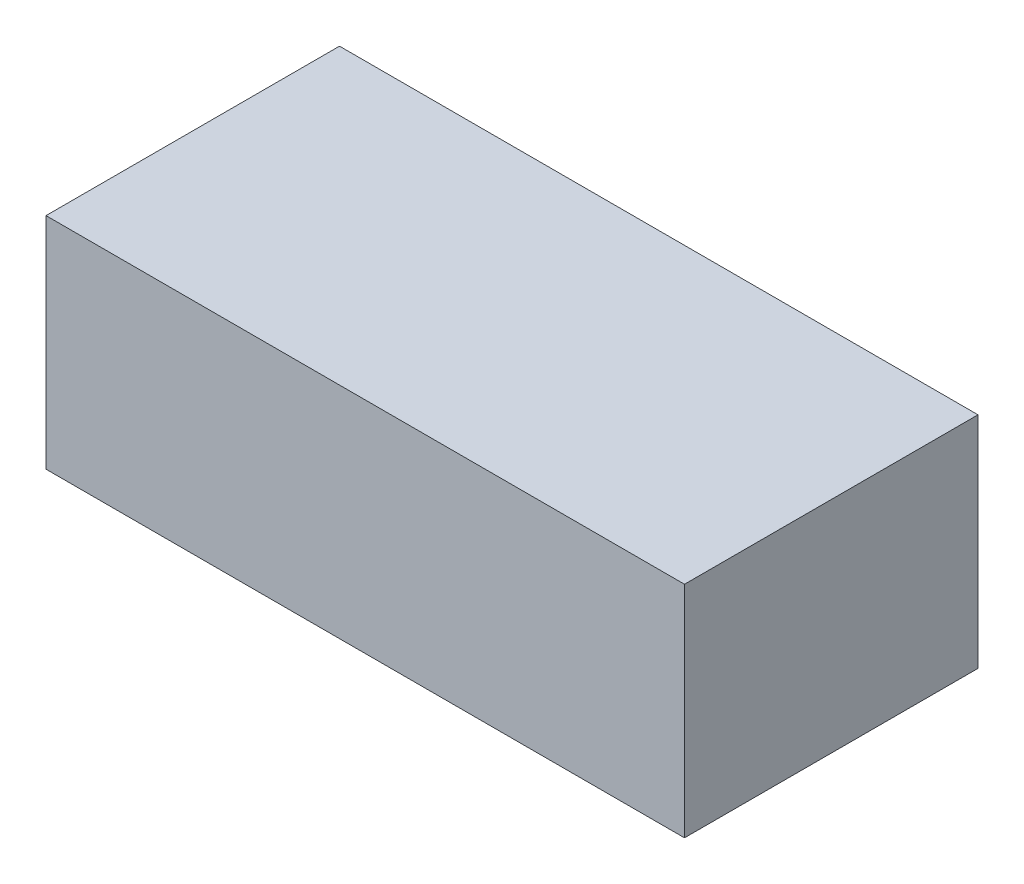
ISO-10303-21;
HEADER;
FILE_DESCRIPTION(('STEP AP214'),'2;1');
FILE_NAME('part.step','',(''),(''),'','','');
FILE_SCHEMA(('AUTOMOTIVE_DESIGN { 1 0 10303 214 1 1 1 1 }'));
ENDSEC;
DATA;
#1=APPLICATION_CONTEXT('core data for automotive mechanical design processes');
#2=APPLICATION_PROTOCOL_DEFINITION('international standard','automotive_design',2000,#1);
#3=PRODUCT_CONTEXT('',#1,'mechanical');
#4=PRODUCT('Part','Part','',(#3));
#5=PRODUCT_RELATED_PRODUCT_CATEGORY('part','',(#4));
#6=PRODUCT_DEFINITION_FORMATION('','',#4);
#7=PRODUCT_DEFINITION_CONTEXT('part definition',#1,'design');
#8=PRODUCT_DEFINITION('design','',#6,#7);
#9=PRODUCT_DEFINITION_SHAPE('','',#8);
#10=(LENGTH_UNIT() NAMED_UNIT(*) SI_UNIT(.MILLI.,.METRE.));
#11=(NAMED_UNIT(*) PLANE_ANGLE_UNIT() SI_UNIT($,.RADIAN.));
#12=(NAMED_UNIT(*) SI_UNIT($,.STERADIAN.) SOLID_ANGLE_UNIT());
#13=UNCERTAINTY_MEASURE_WITH_UNIT(LENGTH_MEASURE(1.E-05),#10,'distance_accuracy_value','');
#14=(GEOMETRIC_REPRESENTATION_CONTEXT(3) GLOBAL_UNCERTAINTY_ASSIGNED_CONTEXT((#13)) GLOBAL_UNIT_ASSIGNED_CONTEXT((#10,
#11,#12)) REPRESENTATION_CONTEXT('',''));
#15=CARTESIAN_POINT('',(0.,0.,0.));
#16=DIRECTION('',(0.,0.,1.));
#17=DIRECTION('',(1.,0.,0.));
#18=AXIS2_PLACEMENT_3D('',#15,#16,#17);
#19=CARTESIAN_POINT('',(0.,0.,0.));
#20=DIRECTION('',(0.,1.,0.));
#21=DIRECTION('',(0.,0.,1.));
#22=AXIS2_PLACEMENT_3D('',#19,#20,#21);
#23=PLANE('',#22);
#24=DIRECTION('',(0.,0.,-1.));
#25=VECTOR('',#24,1.);
#26=CARTESIAN_POINT('',(32.25,0.,-14.5));
#27=LINE('',#26,#25);
#28=CARTESIAN_POINT('',(32.25,0.,13.));
#29=VERTEX_POINT('',#28);
#30=CARTESIAN_POINT('',(32.25,0.,-13.));
#31=VERTEX_POINT('',#30);
#32=EDGE_CURVE('E354',#29,#31,#27,.T.);
#33=ORIENTED_EDGE('',*,*,#32,.T.);
#34=DIRECTION('',(0.707106781186543,0.,0.707106781186552));
#35=VECTOR('',#34,1.);
#36=CARTESIAN_POINT('',(22.6250000000002,0.,-22.6249999999999));
#37=LINE('',#36,#35);
#38=CARTESIAN_POINT('',(30.75,0.,-14.5));
#39=VERTEX_POINT('',#38);
#40=EDGE_CURVE('E11',#31,#39,#37,.F.);
#41=ORIENTED_EDGE('',*,*,#40,.T.);
#42=DIRECTION('',(-1.,0.,0.));
#43=VECTOR('',#42,1.);
#44=CARTESIAN_POINT('',(-32.25,0.,-14.5));
#45=LINE('',#44,#43);
#46=CARTESIAN_POINT('',(30.,0.,-14.5));
#47=VERTEX_POINT('',#46);
#48=EDGE_CURVE('E185',#39,#47,#45,.T.);
#49=ORIENTED_EDGE('',*,*,#48,.T.);
#50=DIRECTION('',(0.,0.,-1.));
#51=VECTOR('',#50,1.);
#52=CARTESIAN_POINT('',(30.,0.,-4.5));
#53=LINE('',#52,#51);
#54=CARTESIAN_POINT('',(30.,0.,-15.1));
#55=VERTEX_POINT('',#54);
#56=EDGE_CURVE('E169',#47,#55,#53,.T.);
#57=ORIENTED_EDGE('',*,*,#56,.T.);
#58=DIRECTION('',(-1.,0.,0.));
#59=VECTOR('',#58,1.);
#60=CARTESIAN_POINT('',(-32.85,0.,-15.1));
#61=LINE('',#60,#59);
#62=CARTESIAN_POINT('',(32.85,0.,-15.1));
#63=VERTEX_POINT('',#62);
#64=EDGE_CURVE('E184',#63,#55,#61,.T.);
#65=ORIENTED_EDGE('',*,*,#64,.F.);
#66=DIRECTION('',(0.,0.,-1.));
#67=VECTOR('',#66,1.);
#68=CARTESIAN_POINT('',(32.85,0.,-15.1));
#69=LINE('',#68,#67);
#70=CARTESIAN_POINT('',(32.85,0.,15.1));
#71=VERTEX_POINT('',#70);
#72=EDGE_CURVE('E202',#71,#63,#69,.T.);
#73=ORIENTED_EDGE('',*,*,#72,.F.);
#74=DIRECTION('',(1.,0.,0.));
#75=VECTOR('',#74,1.);
#76=CARTESIAN_POINT('',(-32.85,0.,15.1));
#77=LINE('',#76,#75);
#78=CARTESIAN_POINT('',(-32.85,0.,15.1));
#79=VERTEX_POINT('',#78);
#80=EDGE_CURVE('E372',#79,#71,#77,.T.);
#81=ORIENTED_EDGE('',*,*,#80,.F.);
#82=DIRECTION('',(0.,0.,1.));
#83=VECTOR('',#82,1.);
#84=CARTESIAN_POINT('',(-32.85,0.,-15.1));
#85=LINE('',#84,#83);
#86=CARTESIAN_POINT('',(-32.85,0.,-15.1));
#87=VERTEX_POINT('',#86);
#88=EDGE_CURVE('E369',#87,#79,#85,.T.);
#89=ORIENTED_EDGE('',*,*,#88,.F.);
#90=CARTESIAN_POINT('',(-30.,0.,-15.1));
#91=VERTEX_POINT('',#90);
#92=EDGE_CURVE('E196',#91,#87,#61,.T.);
#93=ORIENTED_EDGE('',*,*,#92,.F.);
#94=DIRECTION('',(0.,0.,-1.));
#95=VECTOR('',#94,1.);
#96=CARTESIAN_POINT('',(-30.,0.,-4.5));
#97=LINE('',#96,#95);
#98=CARTESIAN_POINT('',(-30.,0.,-14.5));
#99=VERTEX_POINT('',#98);
#100=EDGE_CURVE('E187',#99,#91,#97,.T.);
#101=ORIENTED_EDGE('',*,*,#100,.F.);
#102=CARTESIAN_POINT('',(-30.75,0.,-14.5));
#103=VERTEX_POINT('',#102);
#104=EDGE_CURVE('E348',#99,#103,#45,.T.);
#105=ORIENTED_EDGE('',*,*,#104,.T.);
#106=DIRECTION('',(0.707106781186543,0.,-0.707106781186552));
#107=VECTOR('',#106,1.);
#108=CARTESIAN_POINT('',(-22.6250000000002,0.,-22.6249999999999));
#109=LINE('',#108,#107);
#110=CARTESIAN_POINT('',(-32.25,0.,-13.));
#111=VERTEX_POINT('',#110);
#112=EDGE_CURVE('E49',#103,#111,#109,.F.);
#113=ORIENTED_EDGE('',*,*,#112,.T.);
#114=DIRECTION('',(0.,0.,1.));
#115=VECTOR('',#114,1.);
#116=CARTESIAN_POINT('',(-32.25,0.,-14.5));
#117=LINE('',#116,#115);
#118=CARTESIAN_POINT('',(-32.25,0.,13.));
#119=VERTEX_POINT('',#118);
#120=EDGE_CURVE('E358',#111,#119,#117,.T.);
#121=ORIENTED_EDGE('',*,*,#120,.T.);
#122=DIRECTION('',(-0.707106781186543,0.,-0.707106781186552));
#123=VECTOR('',#122,1.);
#124=CARTESIAN_POINT('',(-22.6250000000002,0.,22.6249999999999));
#125=LINE('',#124,#123);
#126=CARTESIAN_POINT('',(-30.75,0.,14.5));
#127=VERTEX_POINT('',#126);
#128=EDGE_CURVE('E274',#119,#127,#125,.F.);
#129=ORIENTED_EDGE('',*,*,#128,.T.);
#130=DIRECTION('',(1.,0.,0.));
#131=VECTOR('',#130,1.);
#132=CARTESIAN_POINT('',(-32.25,0.,14.5));
#133=LINE('',#132,#131);
#134=CARTESIAN_POINT('',(30.75,0.,14.5));
#135=VERTEX_POINT('',#134);
#136=EDGE_CURVE('E365',#127,#135,#133,.T.);
#137=ORIENTED_EDGE('',*,*,#136,.T.);
#138=DIRECTION('',(-0.707106781186544,0.,0.707106781186551));
#139=VECTOR('',#138,1.);
#140=CARTESIAN_POINT('',(22.6250000000001,0.,22.6249999999999));
#141=LINE('',#140,#139);
#142=EDGE_CURVE('E277',#135,#29,#141,.F.);
#143=ORIENTED_EDGE('',*,*,#142,.T.);
#144=EDGE_LOOP('',(#33,#41,#49,#57,#65,#73,#81,#89,#93,#101,#105,#113,#121,#129,#137,#143));
#145=FACE_BOUND('',#144,.T.);
#146=ADVANCED_FACE('F39',(#145),#23,.F.);
#147=CARTESIAN_POINT('',(-32.85,22.,-15.1));
#148=DIRECTION('',(1.,0.,0.));
#149=DIRECTION('',(0.,0.,-1.));
#150=AXIS2_PLACEMENT_3D('',#147,#148,#149);
#151=PLANE('',#150);
#152=ORIENTED_EDGE('',*,*,#88,.T.);
#153=DIRECTION('',(0.,-1.,0.));
#154=VECTOR('',#153,1.);
#155=CARTESIAN_POINT('',(-32.85,22.,15.1));
#156=LINE('',#155,#154);
#157=CARTESIAN_POINT('',(-32.85,22.6,15.1));
#158=VERTEX_POINT('',#157);
#159=EDGE_CURVE('E212',#158,#79,#156,.T.);
#160=ORIENTED_EDGE('',*,*,#159,.F.);
#161=DIRECTION('',(0.,0.,1.));
#162=VECTOR('',#161,1.);
#163=CARTESIAN_POINT('',(-32.85,22.6,15.1));
#164=LINE('',#163,#162);
#165=CARTESIAN_POINT('',(-32.85,22.6,-15.1));
#166=VERTEX_POINT('',#165);
#167=EDGE_CURVE('E389',#166,#158,#164,.T.);
#168=ORIENTED_EDGE('',*,*,#167,.F.);
#169=DIRECTION('',(0.,-1.,0.));
#170=VECTOR('',#169,1.);
#171=CARTESIAN_POINT('',(-32.85,22.,-15.1));
#172=LINE('',#171,#170);
#173=EDGE_CURVE('E195',#166,#87,#172,.T.);
#174=ORIENTED_EDGE('',*,*,#173,.T.);
#175=EDGE_LOOP('',(#152,#160,#168,#174));
#176=FACE_BOUND('',#175,.T.);
#177=ADVANCED_FACE('F388',(#176),#151,.F.);
#178=CARTESIAN_POINT('',(-32.85,22.,15.1));
#179=DIRECTION('',(0.,0.,-1.));
#180=DIRECTION('',(-1.,0.,0.));
#181=AXIS2_PLACEMENT_3D('',#178,#179,#180);
#182=PLANE('',#181);
#183=ORIENTED_EDGE('',*,*,#80,.T.);
#184=DIRECTION('',(0.,-1.,0.));
#185=VECTOR('',#184,1.);
#186=CARTESIAN_POINT('',(32.85,22.,15.1));
#187=LINE('',#186,#185);
#188=CARTESIAN_POINT('',(32.85,22.6,15.1));
#189=VERTEX_POINT('',#188);
#190=EDGE_CURVE('E208',#189,#71,#187,.T.);
#191=ORIENTED_EDGE('',*,*,#190,.F.);
#192=DIRECTION('',(1.,0.,0.));
#193=VECTOR('',#192,1.);
#194=CARTESIAN_POINT('',(32.85,22.6,15.1));
#195=LINE('',#194,#193);
#196=EDGE_CURVE('E384',#158,#189,#195,.T.);
#197=ORIENTED_EDGE('',*,*,#196,.F.);
#198=ORIENTED_EDGE('',*,*,#159,.T.);
#199=EDGE_LOOP('',(#183,#191,#197,#198));
#200=FACE_BOUND('',#199,.T.);
#201=ADVANCED_FACE('F382',(#200),#182,.F.);
#202=CARTESIAN_POINT('',(32.85,22.,-15.1));
#203=DIRECTION('',(-1.,0.,0.));
#204=DIRECTION('',(0.,0.,1.));
#205=AXIS2_PLACEMENT_3D('',#202,#203,#204);
#206=PLANE('',#205);
#207=ORIENTED_EDGE('',*,*,#72,.T.);
#208=DIRECTION('',(0.,-1.,0.));
#209=VECTOR('',#208,1.);
#210=CARTESIAN_POINT('',(32.85,22.,-15.1));
#211=LINE('',#210,#209);
#212=CARTESIAN_POINT('',(32.85,22.6,-15.1));
#213=VERTEX_POINT('',#212);
#214=EDGE_CURVE('E193',#213,#63,#211,.T.);
#215=ORIENTED_EDGE('',*,*,#214,.F.);
#216=DIRECTION('',(0.,0.,-1.));
#217=VECTOR('',#216,1.);
#218=CARTESIAN_POINT('',(32.85,22.6,15.1));
#219=LINE('',#218,#217);
#220=EDGE_CURVE('E394',#189,#213,#219,.T.);
#221=ORIENTED_EDGE('',*,*,#220,.F.);
#222=ORIENTED_EDGE('',*,*,#190,.T.);
#223=EDGE_LOOP('',(#207,#215,#221,#222));
#224=FACE_BOUND('',#223,.T.);
#225=ADVANCED_FACE('F377',(#224),#206,.F.);
#226=CARTESIAN_POINT('',(-32.85,22.,-15.1));
#227=DIRECTION('',(0.,0.,1.));
#228=DIRECTION('',(1.,0.,0.));
#229=AXIS2_PLACEMENT_3D('',#226,#227,#228);
#230=PLANE('',#229);
#231=ORIENTED_EDGE('',*,*,#64,.T.);
#232=DIRECTION('',(0.,-1.,0.));
#233=VECTOR('',#232,1.);
#234=CARTESIAN_POINT('',(30.,0.,-15.1));
#235=LINE('',#234,#233);
#236=CARTESIAN_POINT('',(30.,15.,-15.1));
#237=VERTEX_POINT('',#236);
#238=EDGE_CURVE('E166',#237,#55,#235,.T.);
#239=ORIENTED_EDGE('',*,*,#238,.F.);
#240=DIRECTION('',(1.,0.,0.));
#241=VECTOR('',#240,1.);
#242=CARTESIAN_POINT('',(30.,15.,-15.1));
#243=LINE('',#242,#241);
#244=CARTESIAN_POINT('',(-30.,15.,-15.1));
#245=VERTEX_POINT('',#244);
#246=EDGE_CURVE('E188',#245,#237,#243,.T.);
#247=ORIENTED_EDGE('',*,*,#246,.F.);
#248=DIRECTION('',(0.,1.,0.));
#249=VECTOR('',#248,1.);
#250=CARTESIAN_POINT('',(-30.,0.,-15.1));
#251=LINE('',#250,#249);
#252=EDGE_CURVE('E178',#91,#245,#251,.T.);
#253=ORIENTED_EDGE('',*,*,#252,.F.);
#254=ORIENTED_EDGE('',*,*,#92,.T.);
#255=ORIENTED_EDGE('',*,*,#173,.F.);
#256=DIRECTION('',(-1.,0.,0.));
#257=VECTOR('',#256,1.);
#258=CARTESIAN_POINT('',(32.85,22.6,-15.1));
#259=LINE('',#258,#257);
#260=EDGE_CURVE('E359',#213,#166,#259,.T.);
#261=ORIENTED_EDGE('',*,*,#260,.F.);
#262=ORIENTED_EDGE('',*,*,#214,.T.);
#263=EDGE_LOOP('',(#231,#239,#247,#253,#254,#255,#261,#262));
#264=FACE_BOUND('',#263,.T.);
#265=ADVANCED_FACE('F191',(#264),#230,.F.);
#266=CARTESIAN_POINT('',(32.25,22.,-14.5));
#267=DIRECTION('',(-1.,0.,0.));
#268=DIRECTION('',(0.,0.,1.));
#269=AXIS2_PLACEMENT_3D('',#266,#267,#268);
#270=PLANE('',#269);
#271=ORIENTED_EDGE('',*,*,#32,.F.);
#272=DIRECTION('',(0.,1.,0.));
#273=VECTOR('',#272,1.);
#274=CARTESIAN_POINT('',(32.25,22.,13.));
#275=LINE('',#274,#273);
#276=CARTESIAN_POINT('',(32.25,20.5,13.));
#277=VERTEX_POINT('',#276);
#278=EDGE_CURVE('E264',#29,#277,#275,.T.);
#279=ORIENTED_EDGE('',*,*,#278,.T.);
#280=DIRECTION('',(0.,0.,-1.));
#281=VECTOR('',#280,1.);
#282=CARTESIAN_POINT('',(32.25,20.5,-14.5));
#283=LINE('',#282,#281);
#284=CARTESIAN_POINT('',(32.25,20.5,-13.));
#285=VERTEX_POINT('',#284);
#286=EDGE_CURVE('E261',#277,#285,#283,.T.);
#287=ORIENTED_EDGE('',*,*,#286,.T.);
#288=DIRECTION('',(0.,-1.,0.));
#289=VECTOR('',#288,1.);
#290=CARTESIAN_POINT('',(32.25,0.,-13.));
#291=LINE('',#290,#289);
#292=EDGE_CURVE('E258',#285,#31,#291,.T.);
#293=ORIENTED_EDGE('',*,*,#292,.T.);
#294=EDGE_LOOP('',(#271,#279,#287,#293));
#295=FACE_BOUND('',#294,.T.);
#296=ADVANCED_FACE('F424',(#295),#270,.T.);
#297=CARTESIAN_POINT('',(-32.25,22.,-14.5));
#298=DIRECTION('',(0.,0.,1.));
#299=DIRECTION('',(1.,0.,0.));
#300=AXIS2_PLACEMENT_3D('',#297,#298,#299);
#301=PLANE('',#300);
#302=DIRECTION('',(-1.,0.,0.));
#303=VECTOR('',#302,1.);
#304=CARTESIAN_POINT('',(-32.25,20.5,-14.5));
#305=LINE('',#304,#303);
#306=CARTESIAN_POINT('',(30.75,20.5,-14.5));
#307=VERTEX_POINT('',#306);
#308=CARTESIAN_POINT('',(-30.75,20.5,-14.5));
#309=VERTEX_POINT('',#308);
#310=EDGE_CURVE('E57',#307,#309,#305,.T.);
#311=ORIENTED_EDGE('',*,*,#310,.T.);
#312=DIRECTION('',(0.,-1.,0.));
#313=VECTOR('',#312,1.);
#314=CARTESIAN_POINT('',(-30.75,0.,-14.5));
#315=LINE('',#314,#313);
#316=EDGE_CURVE('E271',#309,#103,#315,.T.);
#317=ORIENTED_EDGE('',*,*,#316,.T.);
#318=ORIENTED_EDGE('',*,*,#104,.F.);
#319=DIRECTION('',(0.,-1.,0.));
#320=VECTOR('',#319,1.);
#321=CARTESIAN_POINT('',(-30.,22.,-14.5));
#322=LINE('',#321,#320);
#323=CARTESIAN_POINT('',(-30.,15.,-14.5));
#324=VERTEX_POINT('',#323);
#325=EDGE_CURVE('E216',#324,#99,#322,.T.);
#326=ORIENTED_EDGE('',*,*,#325,.F.);
#327=DIRECTION('',(-1.,0.,0.));
#328=VECTOR('',#327,1.);
#329=CARTESIAN_POINT('',(-32.25,15.,-14.5));
#330=LINE('',#329,#328);
#331=CARTESIAN_POINT('',(30.,15.,-14.5));
#332=VERTEX_POINT('',#331);
#333=EDGE_CURVE('E219',#332,#324,#330,.T.);
#334=ORIENTED_EDGE('',*,*,#333,.F.);
#335=DIRECTION('',(0.,1.,0.));
#336=VECTOR('',#335,1.);
#337=CARTESIAN_POINT('',(30.,22.,-14.5));
#338=LINE('',#337,#336);
#339=EDGE_CURVE('E223',#47,#332,#338,.T.);
#340=ORIENTED_EDGE('',*,*,#339,.F.);
#341=ORIENTED_EDGE('',*,*,#48,.F.);
#342=DIRECTION('',(0.,1.,0.));
#343=VECTOR('',#342,1.);
#344=CARTESIAN_POINT('',(30.75,22.,-14.5));
#345=LINE('',#344,#343);
#346=EDGE_CURVE('E62',#39,#307,#345,.T.);
#347=ORIENTED_EDGE('',*,*,#346,.T.);
#348=EDGE_LOOP('',(#311,#317,#318,#326,#334,#340,#341,#347));
#349=FACE_BOUND('',#348,.T.);
#350=ADVANCED_FACE('F346',(#349),#301,.T.);
#351=CARTESIAN_POINT('',(-32.25,22.,-14.5));
#352=DIRECTION('',(1.,0.,0.));
#353=DIRECTION('',(0.,0.,-1.));
#354=AXIS2_PLACEMENT_3D('',#351,#352,#353);
#355=PLANE('',#354);
#356=DIRECTION('',(0.,0.,1.));
#357=VECTOR('',#356,1.);
#358=CARTESIAN_POINT('',(-32.25,20.5,-14.5));
#359=LINE('',#358,#357);
#360=CARTESIAN_POINT('',(-32.25,20.5,-13.));
#361=VERTEX_POINT('',#360);
#362=CARTESIAN_POINT('',(-32.25,20.5,13.));
#363=VERTEX_POINT('',#362);
#364=EDGE_CURVE('E229',#361,#363,#359,.T.);
#365=ORIENTED_EDGE('',*,*,#364,.T.);
#366=DIRECTION('',(0.,-1.,0.));
#367=VECTOR('',#366,1.);
#368=CARTESIAN_POINT('',(-32.25,0.,13.));
#369=LINE('',#368,#367);
#370=EDGE_CURVE('E233',#363,#119,#369,.T.);
#371=ORIENTED_EDGE('',*,*,#370,.T.);
#372=ORIENTED_EDGE('',*,*,#120,.F.);
#373=DIRECTION('',(0.,1.,0.));
#374=VECTOR('',#373,1.);
#375=CARTESIAN_POINT('',(-32.25,22.,-13.));
#376=LINE('',#375,#374);
#377=EDGE_CURVE('E226',#111,#361,#376,.T.);
#378=ORIENTED_EDGE('',*,*,#377,.T.);
#379=EDGE_LOOP('',(#365,#371,#372,#378));
#380=FACE_BOUND('',#379,.T.);
#381=ADVANCED_FACE('F457',(#380),#355,.T.);
#382=CARTESIAN_POINT('',(-32.25,22.,14.5));
#383=DIRECTION('',(0.,0.,-1.));
#384=DIRECTION('',(-1.,0.,0.));
#385=AXIS2_PLACEMENT_3D('',#382,#383,#384);
#386=PLANE('',#385);
#387=ORIENTED_EDGE('',*,*,#136,.F.);
#388=DIRECTION('',(0.,1.,0.));
#389=VECTOR('',#388,1.);
#390=CARTESIAN_POINT('',(-30.75,22.,14.5));
#391=LINE('',#390,#389);
#392=CARTESIAN_POINT('',(-30.75,20.5,14.5));
#393=VERTEX_POINT('',#392);
#394=EDGE_CURVE('E255',#127,#393,#391,.T.);
#395=ORIENTED_EDGE('',*,*,#394,.T.);
#396=DIRECTION('',(1.,0.,0.));
#397=VECTOR('',#396,1.);
#398=CARTESIAN_POINT('',(-32.25,20.5,14.5));
#399=LINE('',#398,#397);
#400=CARTESIAN_POINT('',(30.75,20.5,14.5));
#401=VERTEX_POINT('',#400);
#402=EDGE_CURVE('E252',#393,#401,#399,.T.);
#403=ORIENTED_EDGE('',*,*,#402,.T.);
#404=DIRECTION('',(0.,-1.,0.));
#405=VECTOR('',#404,1.);
#406=CARTESIAN_POINT('',(30.75,0.,14.5));
#407=LINE('',#406,#405);
#408=EDGE_CURVE('E249',#401,#135,#407,.T.);
#409=ORIENTED_EDGE('',*,*,#408,.T.);
#410=EDGE_LOOP('',(#387,#395,#403,#409));
#411=FACE_BOUND('',#410,.T.);
#412=ADVANCED_FACE('F459',(#411),#386,.T.);
#413=CARTESIAN_POINT('',(0.,22.,0.));
#414=DIRECTION('',(0.,1.,0.));
#415=DIRECTION('',(0.,0.,1.));
#416=AXIS2_PLACEMENT_3D('',#413,#414,#415);
#417=PLANE('',#416);
#418=DIRECTION('',(-1.,0.,0.));
#419=VECTOR('',#418,1.);
#420=CARTESIAN_POINT('',(0.,22.,13.));
#421=LINE('',#420,#419);
#422=CARTESIAN_POINT('',(30.75,22.,13.));
#423=VERTEX_POINT('',#422);
#424=CARTESIAN_POINT('',(-30.75,22.,13.));
#425=VERTEX_POINT('',#424);
#426=EDGE_CURVE('E242',#423,#425,#421,.T.);
#427=ORIENTED_EDGE('',*,*,#426,.T.);
#428=DIRECTION('',(0.,0.,-1.));
#429=VECTOR('',#428,1.);
#430=CARTESIAN_POINT('',(-30.75,22.,0.));
#431=LINE('',#430,#429);
#432=CARTESIAN_POINT('',(-30.75,22.,-13.));
#433=VERTEX_POINT('',#432);
#434=EDGE_CURVE('E245',#425,#433,#431,.T.);
#435=ORIENTED_EDGE('',*,*,#434,.T.);
#436=DIRECTION('',(1.,0.,0.));
#437=VECTOR('',#436,1.);
#438=CARTESIAN_POINT('',(0.,22.,-13.));
#439=LINE('',#438,#437);
#440=CARTESIAN_POINT('',(30.75,22.,-13.));
#441=VERTEX_POINT('',#440);
#442=EDGE_CURVE('E236',#433,#441,#439,.T.);
#443=ORIENTED_EDGE('',*,*,#442,.T.);
#444=DIRECTION('',(0.,0.,1.));
#445=VECTOR('',#444,1.);
#446=CARTESIAN_POINT('',(30.75,22.,0.));
#447=LINE('',#446,#445);
#448=EDGE_CURVE('E239',#441,#423,#447,.T.);
#449=ORIENTED_EDGE('',*,*,#448,.T.);
#450=EDGE_LOOP('',(#427,#435,#443,#449));
#451=FACE_BOUND('',#450,.T.);
#452=ADVANCED_FACE('F444',(#451),#417,.F.);
#453=CARTESIAN_POINT('',(0.,22.6,0.));
#454=DIRECTION('',(0.,1.,0.));
#455=DIRECTION('',(0.,0.,1.));
#456=AXIS2_PLACEMENT_3D('',#453,#454,#455);
#457=PLANE('',#456);
#458=ORIENTED_EDGE('',*,*,#167,.T.);
#459=ORIENTED_EDGE('',*,*,#196,.T.);
#460=ORIENTED_EDGE('',*,*,#220,.T.);
#461=ORIENTED_EDGE('',*,*,#260,.T.);
#462=EDGE_LOOP('',(#458,#459,#460,#461));
#463=FACE_BOUND('',#462,.T.);
#464=ADVANCED_FACE('F393',(#463),#457,.T.);
#465=CARTESIAN_POINT('',(30.,0.,-4.5));
#466=DIRECTION('',(1.,0.,0.));
#467=DIRECTION('',(0.,0.,-1.));
#468=AXIS2_PLACEMENT_3D('',#465,#466,#467);
#469=PLANE('',#468);
#470=ORIENTED_EDGE('',*,*,#339,.T.);
#471=DIRECTION('',(0.,0.,-1.));
#472=VECTOR('',#471,1.);
#473=CARTESIAN_POINT('',(30.,15.,-4.5));
#474=LINE('',#473,#472);
#475=EDGE_CURVE('E172',#332,#237,#474,.T.);
#476=ORIENTED_EDGE('',*,*,#475,.T.);
#477=ORIENTED_EDGE('',*,*,#238,.T.);
#478=ORIENTED_EDGE('',*,*,#56,.F.);
#479=EDGE_LOOP('',(#470,#476,#477,#478));
#480=FACE_BOUND('',#479,.T.);
#481=ADVANCED_FACE('F168',(#480),#469,.F.);
#482=CARTESIAN_POINT('',(30.,15.,-4.5));
#483=DIRECTION('',(0.,1.,0.));
#484=DIRECTION('',(-1.,0.,0.));
#485=AXIS2_PLACEMENT_3D('',#482,#483,#484);
#486=PLANE('',#485);
#487=ORIENTED_EDGE('',*,*,#333,.T.);
#488=DIRECTION('',(0.,0.,-1.));
#489=VECTOR('',#488,1.);
#490=CARTESIAN_POINT('',(-30.,15.,-4.5));
#491=LINE('',#490,#489);
#492=EDGE_CURVE('E405',#324,#245,#491,.T.);
#493=ORIENTED_EDGE('',*,*,#492,.T.);
#494=ORIENTED_EDGE('',*,*,#246,.T.);
#495=ORIENTED_EDGE('',*,*,#475,.F.);
#496=EDGE_LOOP('',(#487,#493,#494,#495));
#497=FACE_BOUND('',#496,.T.);
#498=ADVANCED_FACE('F417',(#497),#486,.F.);
#499=CARTESIAN_POINT('',(-30.,0.,-4.5));
#500=DIRECTION('',(-1.,0.,0.));
#501=DIRECTION('',(0.,0.,1.));
#502=AXIS2_PLACEMENT_3D('',#499,#500,#501);
#503=PLANE('',#502);
#504=ORIENTED_EDGE('',*,*,#325,.T.);
#505=ORIENTED_EDGE('',*,*,#100,.T.);
#506=ORIENTED_EDGE('',*,*,#252,.T.);
#507=ORIENTED_EDGE('',*,*,#492,.F.);
#508=EDGE_LOOP('',(#504,#505,#506,#507));
#509=FACE_BOUND('',#508,.T.);
#510=ADVANCED_FACE('F415',(#509),#503,.F.);
#511=CARTESIAN_POINT('',(32.25,22.,-13.));
#512=DIRECTION('',(-0.707106781186552,0.,0.707106781186543));
#513=DIRECTION('',(0.,1.,0.));
#514=AXIS2_PLACEMENT_3D('',#511,#512,#513);
#515=PLANE('',#514);
#516=ORIENTED_EDGE('',*,*,#40,.F.);
#517=ORIENTED_EDGE('',*,*,#292,.F.);
#518=DIRECTION('',(-0.707106781186542,0.,-0.707106781186552));
#519=VECTOR('',#518,1.);
#520=CARTESIAN_POINT('',(32.25,20.5,-13.));
#521=LINE('',#520,#519);
#522=EDGE_CURVE('E319',#307,#285,#521,.F.);
#523=ORIENTED_EDGE('',*,*,#522,.F.);
#524=ORIENTED_EDGE('',*,*,#346,.F.);
#525=EDGE_LOOP('',(#516,#517,#523,#524));
#526=FACE_BOUND('',#525,.T.);
#527=ADVANCED_FACE('F41',(#526),#515,.T.);
#528=CARTESIAN_POINT('',(30.75,22.,14.5));
#529=DIRECTION('',(-0.707106781186551,0.,-0.707106781186544));
#530=DIRECTION('',(0.,1.,0.));
#531=AXIS2_PLACEMENT_3D('',#528,#529,#530);
#532=PLANE('',#531);
#533=ORIENTED_EDGE('',*,*,#142,.F.);
#534=ORIENTED_EDGE('',*,*,#408,.F.);
#535=DIRECTION('',(0.707106781186544,0.,-0.707106781186551));
#536=VECTOR('',#535,1.);
#537=CARTESIAN_POINT('',(30.75,20.5,14.5));
#538=LINE('',#537,#536);
#539=EDGE_CURVE('E316',#277,#401,#538,.F.);
#540=ORIENTED_EDGE('',*,*,#539,.F.);
#541=ORIENTED_EDGE('',*,*,#278,.F.);
#542=EDGE_LOOP('',(#533,#534,#540,#541));
#543=FACE_BOUND('',#542,.T.);
#544=ADVANCED_FACE('F430',(#543),#532,.T.);
#545=CARTESIAN_POINT('',(32.25,20.5,-14.5));
#546=DIRECTION('',(0.707106781186552,0.707106781186543,0.));
#547=DIRECTION('',(0.,0.,-1.));
#548=AXIS2_PLACEMENT_3D('',#545,#546,#547);
#549=PLANE('',#548);
#550=DIRECTION('',(-0.707106781186543,0.707106781186553,0.));
#551=VECTOR('',#550,1.);
#552=CARTESIAN_POINT('',(32.25,20.5,-13.));
#553=LINE('',#552,#551);
#554=EDGE_CURVE('E43',#285,#441,#553,.T.);
#555=ORIENTED_EDGE('',*,*,#554,.F.);
#556=ORIENTED_EDGE('',*,*,#286,.F.);
#557=DIRECTION('',(0.707106781186543,-0.707106781186552,0.));
#558=VECTOR('',#557,1.);
#559=CARTESIAN_POINT('',(31.5,21.25,13.));
#560=LINE('',#559,#558);
#561=EDGE_CURVE('E312',#423,#277,#560,.T.);
#562=ORIENTED_EDGE('',*,*,#561,.F.);
#563=ORIENTED_EDGE('',*,*,#448,.F.);
#564=EDGE_LOOP('',(#555,#556,#562,#563));
#565=FACE_BOUND('',#564,.T.);
#566=ADVANCED_FACE('F433',(#565),#549,.F.);
#567=CARTESIAN_POINT('',(32.25,20.5,-13.));
#568=DIRECTION('',(-0.577350269189634,-0.577350269189626,0.577350269189618));
#569=DIRECTION('',(0.707106781186543,-0.707106781186552,0.));
#570=AXIS2_PLACEMENT_3D('',#567,#568,#569);
#571=PLANE('',#570);
#572=ORIENTED_EDGE('',*,*,#522,.T.);
#573=ORIENTED_EDGE('',*,*,#554,.T.);
#574=DIRECTION('',(0.,-0.707106781186543,-0.707106781186552));
#575=VECTOR('',#574,1.);
#576=CARTESIAN_POINT('',(30.75,21.25,-13.75));
#577=LINE('',#576,#575);
#578=EDGE_CURVE('E308',#307,#441,#577,.F.);
#579=ORIENTED_EDGE('',*,*,#578,.F.);
#580=EDGE_LOOP('',(#572,#573,#579));
#581=FACE_BOUND('',#580,.T.);
#582=ADVANCED_FACE('F327',(#581),#571,.T.);
#583=CARTESIAN_POINT('',(30.75,20.5,14.5));
#584=DIRECTION('',(-0.577350269189633,-0.577350269189617,-0.577350269189628));
#585=DIRECTION('',(-0.707106781186544,0.,0.707106781186551));
#586=AXIS2_PLACEMENT_3D('',#583,#584,#585);
#587=PLANE('',#586);
#588=ORIENTED_EDGE('',*,*,#561,.T.);
#589=ORIENTED_EDGE('',*,*,#539,.T.);
#590=DIRECTION('',(0.,0.707106781186553,-0.707106781186543));
#591=VECTOR('',#590,1.);
#592=CARTESIAN_POINT('',(30.75,20.5,14.5));
#593=LINE('',#592,#591);
#594=EDGE_CURVE('E304',#423,#401,#593,.F.);
#595=ORIENTED_EDGE('',*,*,#594,.F.);
#596=EDGE_LOOP('',(#588,#589,#595));
#597=FACE_BOUND('',#596,.T.);
#598=ADVANCED_FACE('F437',(#597),#587,.T.);
#599=CARTESIAN_POINT('',(-32.25,20.5,-14.5));
#600=DIRECTION('',(0.,0.707106781186552,-0.707106781186543));
#601=DIRECTION('',(-1.,0.,0.));
#602=AXIS2_PLACEMENT_3D('',#599,#600,#601);
#603=PLANE('',#602);
#604=ORIENTED_EDGE('',*,*,#578,.T.);
#605=ORIENTED_EDGE('',*,*,#442,.F.);
#606=DIRECTION('',(0.,0.707106781186543,0.707106781186552));
#607=VECTOR('',#606,1.);
#608=CARTESIAN_POINT('',(-30.75,22.,-13.));
#609=LINE('',#608,#607);
#610=EDGE_CURVE('E300',#309,#433,#609,.T.);
#611=ORIENTED_EDGE('',*,*,#610,.F.);
#612=ORIENTED_EDGE('',*,*,#310,.F.);
#613=EDGE_LOOP('',(#604,#605,#611,#612));
#614=FACE_BOUND('',#613,.T.);
#615=ADVANCED_FACE('F333',(#614),#603,.F.);
#616=CARTESIAN_POINT('',(-30.75,22.,-14.5));
#617=DIRECTION('',(0.707106781186552,0.,0.707106781186543));
#618=DIRECTION('',(0.,1.,0.));
#619=AXIS2_PLACEMENT_3D('',#616,#617,#618);
#620=PLANE('',#619);
#621=ORIENTED_EDGE('',*,*,#112,.F.);
#622=ORIENTED_EDGE('',*,*,#316,.F.);
#623=DIRECTION('',(-0.707106781186542,0.,0.707106781186552));
#624=VECTOR('',#623,1.);
#625=CARTESIAN_POINT('',(-31.5,20.5,-13.75));
#626=LINE('',#625,#624);
#627=EDGE_CURVE('E296',#361,#309,#626,.F.);
#628=ORIENTED_EDGE('',*,*,#627,.F.);
#629=ORIENTED_EDGE('',*,*,#377,.F.);
#630=EDGE_LOOP('',(#621,#622,#628,#629));
#631=FACE_BOUND('',#630,.T.);
#632=ADVANCED_FACE('F343',(#631),#620,.T.);
#633=CARTESIAN_POINT('',(-32.25,22.,13.));
#634=DIRECTION('',(0.707106781186552,0.,-0.707106781186543));
#635=DIRECTION('',(0.,1.,0.));
#636=AXIS2_PLACEMENT_3D('',#633,#634,#635);
#637=PLANE('',#636);
#638=ORIENTED_EDGE('',*,*,#128,.F.);
#639=ORIENTED_EDGE('',*,*,#370,.F.);
#640=DIRECTION('',(0.707106781186543,0.,0.707106781186552));
#641=VECTOR('',#640,1.);
#642=CARTESIAN_POINT('',(-32.25,20.5,13.));
#643=LINE('',#642,#641);
#644=EDGE_CURVE('E292',#393,#363,#643,.F.);
#645=ORIENTED_EDGE('',*,*,#644,.F.);
#646=ORIENTED_EDGE('',*,*,#394,.F.);
#647=EDGE_LOOP('',(#638,#639,#645,#646));
#648=FACE_BOUND('',#647,.T.);
#649=ADVANCED_FACE('F455',(#648),#637,.T.);
#650=CARTESIAN_POINT('',(-32.25,20.5,14.5));
#651=DIRECTION('',(0.,0.707106781186543,0.707106781186552));
#652=DIRECTION('',(1.,0.,0.));
#653=AXIS2_PLACEMENT_3D('',#650,#651,#652);
#654=PLANE('',#653);
#655=ORIENTED_EDGE('',*,*,#594,.T.);
#656=ORIENTED_EDGE('',*,*,#402,.F.);
#657=DIRECTION('',(0.,-0.707106781186552,0.707106781186543));
#658=VECTOR('',#657,1.);
#659=CARTESIAN_POINT('',(-30.75,21.25,13.75));
#660=LINE('',#659,#658);
#661=EDGE_CURVE('E288',#425,#393,#660,.T.);
#662=ORIENTED_EDGE('',*,*,#661,.F.);
#663=ORIENTED_EDGE('',*,*,#426,.F.);
#664=EDGE_LOOP('',(#655,#656,#662,#663));
#665=FACE_BOUND('',#664,.T.);
#666=ADVANCED_FACE('F441',(#665),#654,.F.);
#667=CARTESIAN_POINT('',(-30.75,22.,-13.));
#668=DIRECTION('',(0.577350269189634,-0.577350269189626,0.577350269189618));
#669=DIRECTION('',(0.707106781186543,0.707106781186552,0.));
#670=AXIS2_PLACEMENT_3D('',#667,#668,#669);
#671=PLANE('',#670);
#672=ORIENTED_EDGE('',*,*,#627,.T.);
#673=ORIENTED_EDGE('',*,*,#610,.T.);
#674=DIRECTION('',(-0.707106781186543,-0.707106781186552,0.));
#675=VECTOR('',#674,1.);
#676=CARTESIAN_POINT('',(-30.75,22.,-13.));
#677=LINE('',#676,#675);
#678=EDGE_CURVE('E285',#361,#433,#677,.F.);
#679=ORIENTED_EDGE('',*,*,#678,.F.);
#680=EDGE_LOOP('',(#672,#673,#679));
#681=FACE_BOUND('',#680,.T.);
#682=ADVANCED_FACE('F338',(#681),#671,.T.);
#683=CARTESIAN_POINT('',(-32.25,20.5,13.));
#684=DIRECTION('',(0.577350269189634,-0.577350269189618,-0.577350269189626));
#685=DIRECTION('',(-0.707106781186543,0.,-0.707106781186552));
#686=AXIS2_PLACEMENT_3D('',#683,#684,#685);
#687=PLANE('',#686);
#688=ORIENTED_EDGE('',*,*,#661,.T.);
#689=ORIENTED_EDGE('',*,*,#644,.T.);
#690=DIRECTION('',(0.707106781186543,0.707106781186552,0.));
#691=VECTOR('',#690,1.);
#692=CARTESIAN_POINT('',(-32.25,20.5,13.));
#693=LINE('',#692,#691);
#694=EDGE_CURVE('E282',#425,#363,#693,.F.);
#695=ORIENTED_EDGE('',*,*,#694,.F.);
#696=EDGE_LOOP('',(#688,#689,#695));
#697=FACE_BOUND('',#696,.T.);
#698=ADVANCED_FACE('F449',(#697),#687,.T.);
#699=CARTESIAN_POINT('',(-32.25,20.5,-14.5));
#700=DIRECTION('',(-0.707106781186552,0.707106781186543,0.));
#701=DIRECTION('',(0.,0.,1.));
#702=AXIS2_PLACEMENT_3D('',#699,#700,#701);
#703=PLANE('',#702);
#704=ORIENTED_EDGE('',*,*,#678,.T.);
#705=ORIENTED_EDGE('',*,*,#434,.F.);
#706=ORIENTED_EDGE('',*,*,#694,.T.);
#707=ORIENTED_EDGE('',*,*,#364,.F.);
#708=EDGE_LOOP('',(#704,#705,#706,#707));
#709=FACE_BOUND('',#708,.T.);
#710=ADVANCED_FACE('F447',(#709),#703,.F.);
#711=CLOSED_SHELL('',(#146,#177,#201,#225,#265,#296,#350,#381,#412,#452,#464,#481,#498,#510,
#527,#544,#566,#582,#598,#615,#632,#649,#666,#682,#698,#710));
#712=MANIFOLD_SOLID_BREP('B2',#711);
#713=ADVANCED_BREP_SHAPE_REPRESENTATION('',(#18,#712),#14);
#714=SHAPE_DEFINITION_REPRESENTATION(#9,#713);
ENDSEC;
END-ISO-10303-21;
